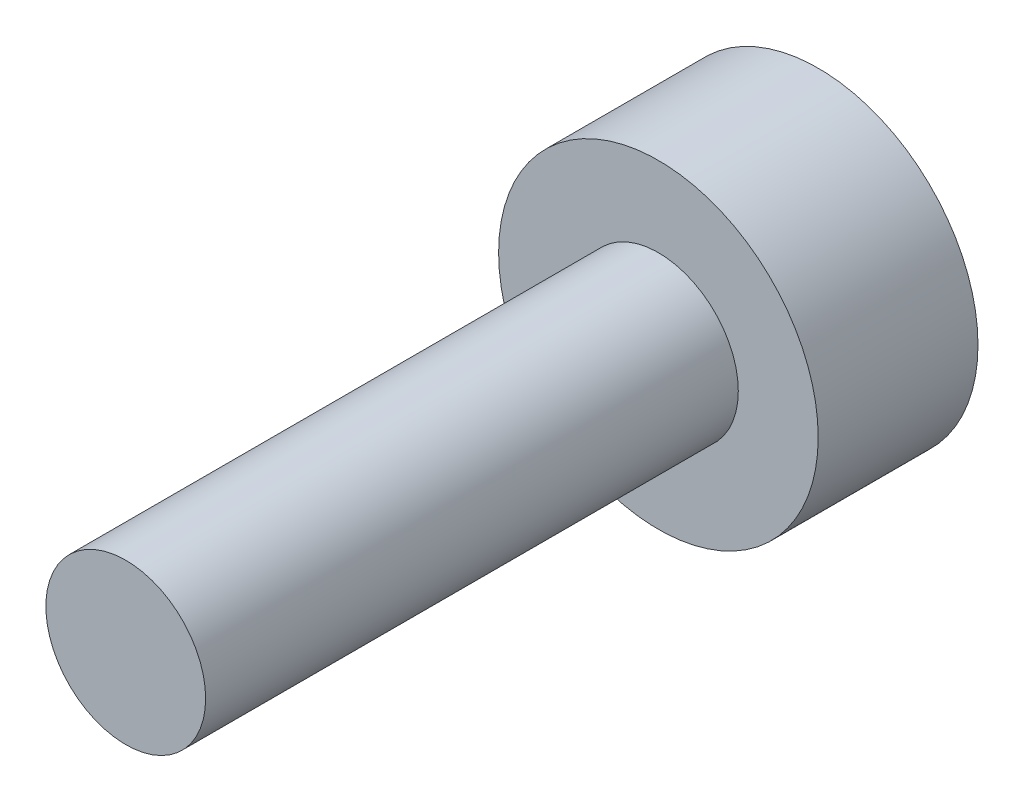
ISO-10303-21;
HEADER;
FILE_DESCRIPTION(('STEP AP214'),'2;1');
FILE_NAME('part.step','',(''),(''),'','','');
FILE_SCHEMA(('AUTOMOTIVE_DESIGN { 1 0 10303 214 1 1 1 1 }'));
ENDSEC;
DATA;
#1=APPLICATION_CONTEXT('core data for automotive mechanical design processes');
#2=APPLICATION_PROTOCOL_DEFINITION('international standard','automotive_design',2000,#1);
#3=PRODUCT_CONTEXT('',#1,'mechanical');
#4=PRODUCT('Part','Part','',(#3));
#5=PRODUCT_RELATED_PRODUCT_CATEGORY('part','',(#4));
#6=PRODUCT_DEFINITION_FORMATION('','',#4);
#7=PRODUCT_DEFINITION_CONTEXT('part definition',#1,'design');
#8=PRODUCT_DEFINITION('design','',#6,#7);
#9=PRODUCT_DEFINITION_SHAPE('','',#8);
#10=(LENGTH_UNIT() NAMED_UNIT(*) SI_UNIT(.MILLI.,.METRE.));
#11=(NAMED_UNIT(*) PLANE_ANGLE_UNIT() SI_UNIT($,.RADIAN.));
#12=(NAMED_UNIT(*) SI_UNIT($,.STERADIAN.) SOLID_ANGLE_UNIT());
#13=UNCERTAINTY_MEASURE_WITH_UNIT(LENGTH_MEASURE(1.E-05),#10,'distance_accuracy_value','');
#14=(GEOMETRIC_REPRESENTATION_CONTEXT(3) GLOBAL_UNCERTAINTY_ASSIGNED_CONTEXT((#13)) GLOBAL_UNIT_ASSIGNED_CONTEXT((#10,
#11,#12)) REPRESENTATION_CONTEXT('',''));
#15=CARTESIAN_POINT('',(0.,0.,0.));
#16=DIRECTION('',(0.,0.,1.));
#17=DIRECTION('',(1.,0.,0.));
#18=AXIS2_PLACEMENT_3D('',#15,#16,#17);
#19=CARTESIAN_POINT('',(0.,0.,3.));
#20=DIRECTION('',(0.,0.,-1.));
#21=DIRECTION('',(-1.,0.,0.));
#22=AXIS2_PLACEMENT_3D('',#19,#20,#21);
#23=CYLINDRICAL_SURFACE('',#22,3.);
#24=CARTESIAN_POINT('',(0.,0.,3.));
#25=DIRECTION('',(0.,0.,1.));
#26=DIRECTION('',(1.,0.,0.));
#27=AXIS2_PLACEMENT_3D('',#24,#25,#26);
#28=CIRCLE('',#27,3.);
#29=CARTESIAN_POINT('',(3.,0.,3.));
#30=VERTEX_POINT('',#29);
#31=EDGE_CURVE('E46',#30,#30,#28,.T.);
#32=ORIENTED_EDGE('',*,*,#31,.F.);
#33=EDGE_LOOP('',(#32));
#34=FACE_BOUND('',#33,.T.);
#35=CARTESIAN_POINT('',(0.,0.,0.));
#36=DIRECTION('',(0.,0.,1.));
#37=DIRECTION('',(1.,0.,0.));
#38=AXIS2_PLACEMENT_3D('',#35,#36,#37);
#39=CIRCLE('',#38,3.);
#40=CARTESIAN_POINT('',(3.,0.,0.));
#41=VERTEX_POINT('',#40);
#42=EDGE_CURVE('E42',#41,#41,#39,.T.);
#43=ORIENTED_EDGE('',*,*,#42,.T.);
#44=EDGE_LOOP('',(#43));
#45=FACE_BOUND('',#44,.T.);
#46=ADVANCED_FACE('F39',(#34,#45),#23,.T.);
#47=CARTESIAN_POINT('',(0.,0.,3.));
#48=DIRECTION('',(0.,0.,1.));
#49=DIRECTION('',(1.,0.,0.));
#50=AXIS2_PLACEMENT_3D('',#47,#48,#49);
#51=PLANE('',#50);
#52=CARTESIAN_POINT('',(0.,0.,3.));
#53=DIRECTION('',(0.,0.,1.));
#54=DIRECTION('',(1.,0.,0.));
#55=AXIS2_PLACEMENT_3D('',#52,#53,#54);
#56=CIRCLE('',#55,1.5);
#57=CARTESIAN_POINT('',(1.5,0.,3.));
#58=VERTEX_POINT('',#57);
#59=EDGE_CURVE('E10',#58,#58,#56,.T.);
#60=ORIENTED_EDGE('',*,*,#59,.F.);
#61=EDGE_LOOP('',(#60));
#62=FACE_BOUND('',#61,.T.);
#63=ORIENTED_EDGE('',*,*,#31,.T.);
#64=EDGE_LOOP('',(#63));
#65=FACE_BOUND('',#64,.T.);
#66=ADVANCED_FACE('F63',(#62,#65),#51,.T.);
#67=CARTESIAN_POINT('',(0.,0.,0.));
#68=DIRECTION('',(0.,0.,1.));
#69=DIRECTION('',(1.,0.,0.));
#70=AXIS2_PLACEMENT_3D('',#67,#68,#69);
#71=PLANE('',#70);
#72=ORIENTED_EDGE('',*,*,#42,.F.);
#73=EDGE_LOOP('',(#72));
#74=FACE_BOUND('',#73,.T.);
#75=ADVANCED_FACE('F60',(#74),#71,.F.);
#76=CARTESIAN_POINT('',(0.,0.,13.));
#77=DIRECTION('',(0.,0.,-1.));
#78=DIRECTION('',(-1.,0.,0.));
#79=AXIS2_PLACEMENT_3D('',#76,#77,#78);
#80=CYLINDRICAL_SURFACE('',#79,1.5);
#81=CARTESIAN_POINT('',(0.,0.,13.));
#82=DIRECTION('',(0.,0.,1.));
#83=DIRECTION('',(1.,0.,0.));
#84=AXIS2_PLACEMENT_3D('',#81,#82,#83);
#85=CIRCLE('',#84,1.5);
#86=CARTESIAN_POINT('',(1.5,0.,13.));
#87=VERTEX_POINT('',#86);
#88=EDGE_CURVE('E52',#87,#87,#85,.T.);
#89=ORIENTED_EDGE('',*,*,#88,.F.);
#90=EDGE_LOOP('',(#89));
#91=FACE_BOUND('',#90,.T.);
#92=ORIENTED_EDGE('',*,*,#59,.T.);
#93=EDGE_LOOP('',(#92));
#94=FACE_BOUND('',#93,.T.);
#95=ADVANCED_FACE('F62',(#91,#94),#80,.T.);
#96=CARTESIAN_POINT('',(0.,0.,13.));
#97=DIRECTION('',(0.,0.,1.));
#98=DIRECTION('',(1.,0.,0.));
#99=AXIS2_PLACEMENT_3D('',#96,#97,#98);
#100=PLANE('',#99);
#101=ORIENTED_EDGE('',*,*,#88,.T.);
#102=EDGE_LOOP('',(#101));
#103=FACE_BOUND('',#102,.T.);
#104=ADVANCED_FACE('F69',(#103),#100,.T.);
#105=CLOSED_SHELL('',(#46,#66,#75,#95,#104));
#106=MANIFOLD_SOLID_BREP('B2',#105);
#107=ADVANCED_BREP_SHAPE_REPRESENTATION('',(#18,#106),#14);
#108=SHAPE_DEFINITION_REPRESENTATION(#9,#107);
ENDSEC;
END-ISO-10303-21;
